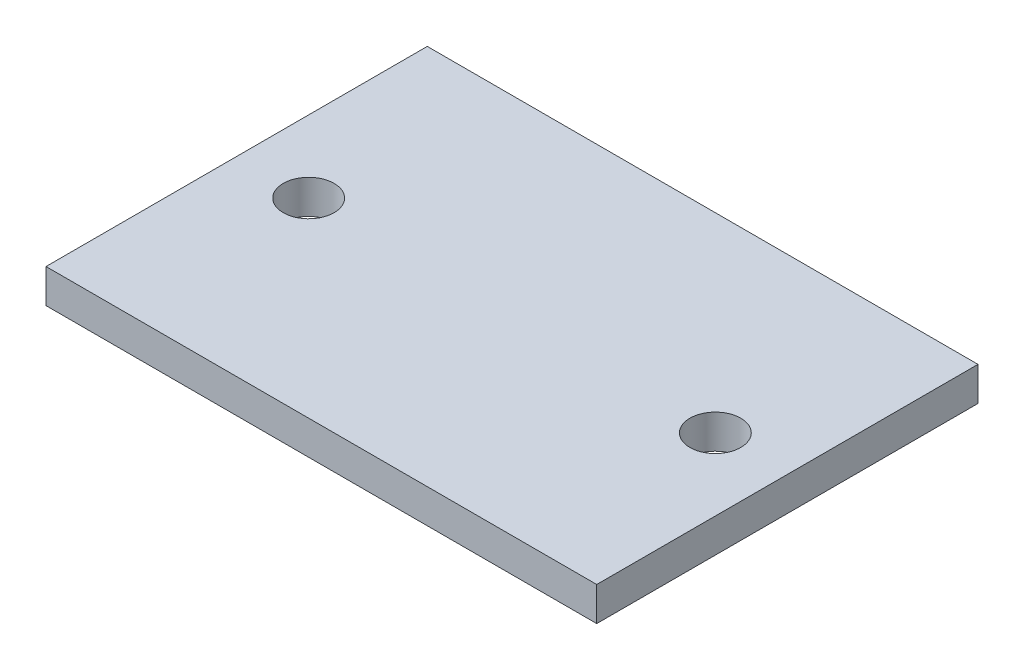
ISO-10303-21;
HEADER;
FILE_DESCRIPTION(('STEP AP214'),'2;1');
FILE_NAME('part.step','',(''),(''),'','','');
FILE_SCHEMA(('AUTOMOTIVE_DESIGN { 1 0 10303 214 1 1 1 1 }'));
ENDSEC;
DATA;
#1=APPLICATION_CONTEXT('core data for automotive mechanical design processes');
#2=APPLICATION_PROTOCOL_DEFINITION('international standard','automotive_design',2000,#1);
#3=PRODUCT_CONTEXT('',#1,'mechanical');
#4=PRODUCT('Part','Part','',(#3));
#5=PRODUCT_RELATED_PRODUCT_CATEGORY('part','',(#4));
#6=PRODUCT_DEFINITION_FORMATION('','',#4);
#7=PRODUCT_DEFINITION_CONTEXT('part definition',#1,'design');
#8=PRODUCT_DEFINITION('design','',#6,#7);
#9=PRODUCT_DEFINITION_SHAPE('','',#8);
#10=(LENGTH_UNIT() NAMED_UNIT(*) SI_UNIT(.MILLI.,.METRE.));
#11=(NAMED_UNIT(*) PLANE_ANGLE_UNIT() SI_UNIT($,.RADIAN.));
#12=(NAMED_UNIT(*) SI_UNIT($,.STERADIAN.) SOLID_ANGLE_UNIT());
#13=UNCERTAINTY_MEASURE_WITH_UNIT(LENGTH_MEASURE(1.E-05),#10,'distance_accuracy_value','');
#14=(GEOMETRIC_REPRESENTATION_CONTEXT(3) GLOBAL_UNCERTAINTY_ASSIGNED_CONTEXT((#13)) GLOBAL_UNIT_ASSIGNED_CONTEXT((#10,
#11,#12)) REPRESENTATION_CONTEXT('',''));
#15=CARTESIAN_POINT('',(0.,0.,0.));
#16=DIRECTION('',(0.,0.,1.));
#17=DIRECTION('',(1.,0.,0.));
#18=AXIS2_PLACEMENT_3D('',#15,#16,#17);
#19=CARTESIAN_POINT('',(-32.5,4.,22.5));
#20=DIRECTION('',(1.,0.,0.));
#21=DIRECTION('',(0.,0.,-1.));
#22=AXIS2_PLACEMENT_3D('',#19,#20,#21);
#23=PLANE('',#22);
#24=DIRECTION('',(0.,0.,1.));
#25=VECTOR('',#24,1.);
#26=CARTESIAN_POINT('',(-32.5,0.,22.5));
#27=LINE('',#26,#25);
#28=CARTESIAN_POINT('',(-32.5,0.,-22.5));
#29=VERTEX_POINT('',#28);
#30=CARTESIAN_POINT('',(-32.5,0.,22.5));
#31=VERTEX_POINT('',#30);
#32=EDGE_CURVE('E111',#29,#31,#27,.T.);
#33=ORIENTED_EDGE('',*,*,#32,.T.);
#34=DIRECTION('',(0.,-1.,0.));
#35=VECTOR('',#34,1.);
#36=CARTESIAN_POINT('',(-32.5,4.,22.5));
#37=LINE('',#36,#35);
#38=CARTESIAN_POINT('',(-32.5,4.,22.5));
#39=VERTEX_POINT('',#38);
#40=EDGE_CURVE('E11',#39,#31,#37,.T.);
#41=ORIENTED_EDGE('',*,*,#40,.F.);
#42=DIRECTION('',(0.,0.,1.));
#43=VECTOR('',#42,1.);
#44=CARTESIAN_POINT('',(-32.5,4.,22.5));
#45=LINE('',#44,#43);
#46=CARTESIAN_POINT('',(-32.5,4.,-22.5));
#47=VERTEX_POINT('',#46);
#48=EDGE_CURVE('E95',#47,#39,#45,.T.);
#49=ORIENTED_EDGE('',*,*,#48,.F.);
#50=DIRECTION('',(0.,-1.,0.));
#51=VECTOR('',#50,1.);
#52=CARTESIAN_POINT('',(-32.5,4.,-22.5));
#53=LINE('',#52,#51);
#54=EDGE_CURVE('E107',#47,#29,#53,.T.);
#55=ORIENTED_EDGE('',*,*,#54,.T.);
#56=EDGE_LOOP('',(#33,#41,#49,#55));
#57=FACE_BOUND('',#56,.T.);
#58=ADVANCED_FACE('F43',(#57),#23,.F.);
#59=CARTESIAN_POINT('',(32.5,4.,22.5));
#60=DIRECTION('',(0.,0.,-1.));
#61=DIRECTION('',(-1.,0.,0.));
#62=AXIS2_PLACEMENT_3D('',#59,#60,#61);
#63=PLANE('',#62);
#64=DIRECTION('',(1.,0.,0.));
#65=VECTOR('',#64,1.);
#66=CARTESIAN_POINT('',(32.5,0.,22.5));
#67=LINE('',#66,#65);
#68=CARTESIAN_POINT('',(32.5,0.,22.5));
#69=VERTEX_POINT('',#68);
#70=EDGE_CURVE('E100',#31,#69,#67,.T.);
#71=ORIENTED_EDGE('',*,*,#70,.T.);
#72=DIRECTION('',(0.,-1.,0.));
#73=VECTOR('',#72,1.);
#74=CARTESIAN_POINT('',(32.5,4.,22.5));
#75=LINE('',#74,#73);
#76=CARTESIAN_POINT('',(32.5,4.,22.5));
#77=VERTEX_POINT('',#76);
#78=EDGE_CURVE('E52',#77,#69,#75,.T.);
#79=ORIENTED_EDGE('',*,*,#78,.F.);
#80=DIRECTION('',(1.,0.,0.));
#81=VECTOR('',#80,1.);
#82=CARTESIAN_POINT('',(32.5,4.,22.5));
#83=LINE('',#82,#81);
#84=EDGE_CURVE('E90',#39,#77,#83,.T.);
#85=ORIENTED_EDGE('',*,*,#84,.F.);
#86=ORIENTED_EDGE('',*,*,#40,.T.);
#87=EDGE_LOOP('',(#71,#79,#85,#86));
#88=FACE_BOUND('',#87,.T.);
#89=ADVANCED_FACE('F99',(#88),#63,.F.);
#90=CARTESIAN_POINT('',(32.5,4.,22.5));
#91=DIRECTION('',(-1.,0.,0.));
#92=DIRECTION('',(0.,0.,1.));
#93=AXIS2_PLACEMENT_3D('',#90,#91,#92);
#94=PLANE('',#93);
#95=DIRECTION('',(0.,0.,-1.));
#96=VECTOR('',#95,1.);
#97=CARTESIAN_POINT('',(32.5,0.,22.5));
#98=LINE('',#97,#96);
#99=CARTESIAN_POINT('',(32.5,0.,-22.5));
#100=VERTEX_POINT('',#99);
#101=EDGE_CURVE('E77',#69,#100,#98,.T.);
#102=ORIENTED_EDGE('',*,*,#101,.T.);
#103=DIRECTION('',(0.,-1.,0.));
#104=VECTOR('',#103,1.);
#105=CARTESIAN_POINT('',(32.5,4.,-22.5));
#106=LINE('',#105,#104);
#107=CARTESIAN_POINT('',(32.5,4.,-22.5));
#108=VERTEX_POINT('',#107);
#109=EDGE_CURVE('E102',#108,#100,#106,.T.);
#110=ORIENTED_EDGE('',*,*,#109,.F.);
#111=DIRECTION('',(0.,0.,-1.));
#112=VECTOR('',#111,1.);
#113=CARTESIAN_POINT('',(32.5,4.,22.5));
#114=LINE('',#113,#112);
#115=EDGE_CURVE('E93',#77,#108,#114,.T.);
#116=ORIENTED_EDGE('',*,*,#115,.F.);
#117=ORIENTED_EDGE('',*,*,#78,.T.);
#118=EDGE_LOOP('',(#102,#110,#116,#117));
#119=FACE_BOUND('',#118,.T.);
#120=ADVANCED_FACE('F103',(#119),#94,.F.);
#121=CARTESIAN_POINT('',(32.5,4.,-22.5));
#122=DIRECTION('',(0.,0.,1.));
#123=DIRECTION('',(1.,0.,0.));
#124=AXIS2_PLACEMENT_3D('',#121,#122,#123);
#125=PLANE('',#124);
#126=DIRECTION('',(-1.,0.,0.));
#127=VECTOR('',#126,1.);
#128=CARTESIAN_POINT('',(32.5,0.,-22.5));
#129=LINE('',#128,#127);
#130=EDGE_CURVE('E83',#100,#29,#129,.T.);
#131=ORIENTED_EDGE('',*,*,#130,.T.);
#132=ORIENTED_EDGE('',*,*,#54,.F.);
#133=DIRECTION('',(-1.,0.,0.));
#134=VECTOR('',#133,1.);
#135=CARTESIAN_POINT('',(32.5,4.,-22.5));
#136=LINE('',#135,#134);
#137=EDGE_CURVE('E60',#108,#47,#136,.T.);
#138=ORIENTED_EDGE('',*,*,#137,.F.);
#139=ORIENTED_EDGE('',*,*,#109,.T.);
#140=EDGE_LOOP('',(#131,#132,#138,#139));
#141=FACE_BOUND('',#140,.T.);
#142=ADVANCED_FACE('F125',(#141),#125,.F.);
#143=CARTESIAN_POINT('',(0.,4.,0.));
#144=DIRECTION('',(0.,1.,0.));
#145=DIRECTION('',(0.,0.,1.));
#146=AXIS2_PLACEMENT_3D('',#143,#144,#145);
#147=PLANE('',#146);
#148=CARTESIAN_POINT('',(-24.,4.,0.));
#149=DIRECTION('',(0.,1.,0.));
#150=DIRECTION('',(0.,0.,1.));
#151=AXIS2_PLACEMENT_3D('',#148,#149,#150);
#152=CIRCLE('',#151,3.);
#153=CARTESIAN_POINT('',(-24.,4.,3.));
#154=VERTEX_POINT('',#153);
#155=EDGE_CURVE('E115',#154,#154,#152,.T.);
#156=ORIENTED_EDGE('',*,*,#155,.F.);
#157=EDGE_LOOP('',(#156));
#158=FACE_BOUND('',#157,.T.);
#159=CARTESIAN_POINT('',(24.,4.,0.));
#160=DIRECTION('',(0.,1.,0.));
#161=DIRECTION('',(0.,0.,1.));
#162=AXIS2_PLACEMENT_3D('',#159,#160,#161);
#163=CIRCLE('',#162,3.);
#164=CARTESIAN_POINT('',(24.,4.,3.));
#165=VERTEX_POINT('',#164);
#166=EDGE_CURVE('E135',#165,#165,#163,.T.);
#167=ORIENTED_EDGE('',*,*,#166,.F.);
#168=EDGE_LOOP('',(#167));
#169=FACE_BOUND('',#168,.T.);
#170=ORIENTED_EDGE('',*,*,#48,.T.);
#171=ORIENTED_EDGE('',*,*,#84,.T.);
#172=ORIENTED_EDGE('',*,*,#115,.T.);
#173=ORIENTED_EDGE('',*,*,#137,.T.);
#174=EDGE_LOOP('',(#170,#171,#172,#173));
#175=FACE_BOUND('',#174,.T.);
#176=ADVANCED_FACE('F91',(#158,#169,#175),#147,.T.);
#177=CARTESIAN_POINT('',(0.,0.,0.));
#178=DIRECTION('',(0.,1.,0.));
#179=DIRECTION('',(0.,0.,1.));
#180=AXIS2_PLACEMENT_3D('',#177,#178,#179);
#181=PLANE('',#180);
#182=CARTESIAN_POINT('',(-24.,0.,0.));
#183=DIRECTION('',(0.,1.,0.));
#184=DIRECTION('',(0.,0.,1.));
#185=AXIS2_PLACEMENT_3D('',#182,#183,#184);
#186=CIRCLE('',#185,3.);
#187=CARTESIAN_POINT('',(-24.,0.,3.));
#188=VERTEX_POINT('',#187);
#189=EDGE_CURVE('E139',#188,#188,#186,.T.);
#190=ORIENTED_EDGE('',*,*,#189,.T.);
#191=EDGE_LOOP('',(#190));
#192=FACE_BOUND('',#191,.T.);
#193=CARTESIAN_POINT('',(24.,0.,0.));
#194=DIRECTION('',(0.,1.,0.));
#195=DIRECTION('',(0.,0.,1.));
#196=AXIS2_PLACEMENT_3D('',#193,#194,#195);
#197=CIRCLE('',#196,3.);
#198=CARTESIAN_POINT('',(24.,0.,3.));
#199=VERTEX_POINT('',#198);
#200=EDGE_CURVE('E140',#199,#199,#197,.T.);
#201=ORIENTED_EDGE('',*,*,#200,.T.);
#202=EDGE_LOOP('',(#201));
#203=FACE_BOUND('',#202,.T.);
#204=ORIENTED_EDGE('',*,*,#32,.F.);
#205=ORIENTED_EDGE('',*,*,#130,.F.);
#206=ORIENTED_EDGE('',*,*,#101,.F.);
#207=ORIENTED_EDGE('',*,*,#70,.F.);
#208=EDGE_LOOP('',(#204,#205,#206,#207));
#209=FACE_BOUND('',#208,.T.);
#210=ADVANCED_FACE('F128',(#192,#203,#209),#181,.F.);
#211=CARTESIAN_POINT('',(24.,0.,0.));
#212=DIRECTION('',(0.,1.,0.));
#213=DIRECTION('',(0.,0.,1.));
#214=AXIS2_PLACEMENT_3D('',#211,#212,#213);
#215=CYLINDRICAL_SURFACE('',#214,3.);
#216=ORIENTED_EDGE('',*,*,#166,.T.);
#217=EDGE_LOOP('',(#216));
#218=FACE_BOUND('',#217,.T.);
#219=ORIENTED_EDGE('',*,*,#200,.F.);
#220=EDGE_LOOP('',(#219));
#221=FACE_BOUND('',#220,.T.);
#222=ADVANCED_FACE('F152',(#218,#221),#215,.F.);
#223=CARTESIAN_POINT('',(-24.,0.,0.));
#224=DIRECTION('',(0.,1.,0.));
#225=DIRECTION('',(0.,0.,1.));
#226=AXIS2_PLACEMENT_3D('',#223,#224,#225);
#227=CYLINDRICAL_SURFACE('',#226,3.);
#228=ORIENTED_EDGE('',*,*,#155,.T.);
#229=EDGE_LOOP('',(#228));
#230=FACE_BOUND('',#229,.T.);
#231=ORIENTED_EDGE('',*,*,#189,.F.);
#232=EDGE_LOOP('',(#231));
#233=FACE_BOUND('',#232,.T.);
#234=ADVANCED_FACE('F150',(#230,#233),#227,.F.);
#235=CLOSED_SHELL('',(#58,#89,#120,#142,#176,#210,#222,#234));
#236=MANIFOLD_SOLID_BREP('B2',#235);
#237=ADVANCED_BREP_SHAPE_REPRESENTATION('',(#18,#236),#14);
#238=SHAPE_DEFINITION_REPRESENTATION(#9,#237);
ENDSEC;
END-ISO-10303-21;
